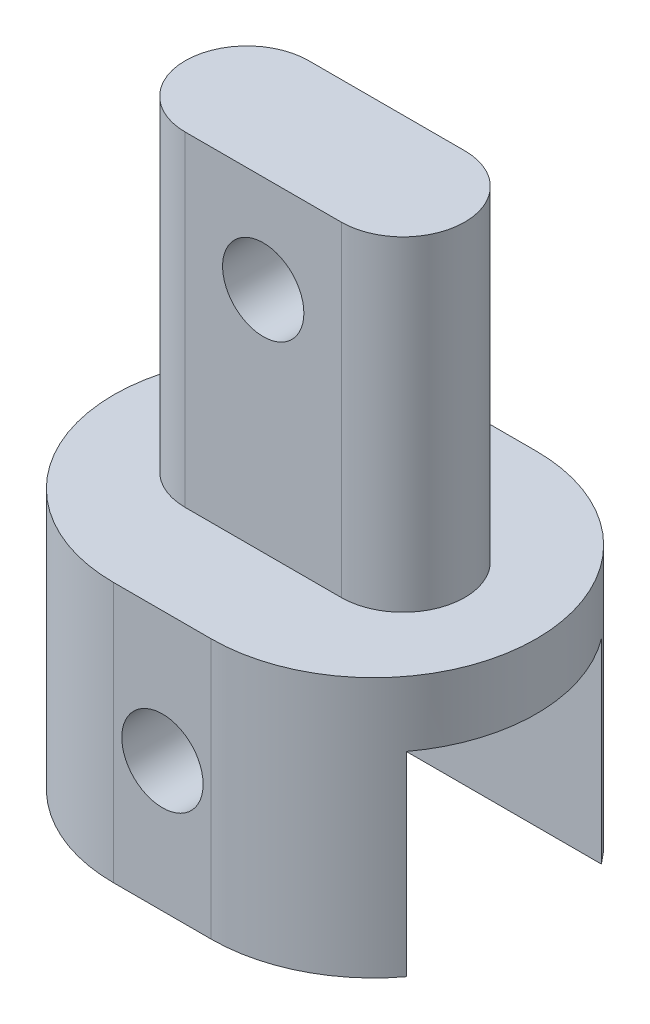
ISO-10303-21;
HEADER;
FILE_DESCRIPTION(('STEP AP214'),'2;1');
FILE_NAME('part.step','',(''),(''),'','','');
FILE_SCHEMA(('AUTOMOTIVE_DESIGN { 1 0 10303 214 1 1 1 1 }'));
ENDSEC;
DATA;
#1=APPLICATION_CONTEXT('core data for automotive mechanical design processes');
#2=APPLICATION_PROTOCOL_DEFINITION('international standard','automotive_design',2000,#1);
#3=PRODUCT_CONTEXT('',#1,'mechanical');
#4=PRODUCT('Part','Part','',(#3));
#5=PRODUCT_RELATED_PRODUCT_CATEGORY('part','',(#4));
#6=PRODUCT_DEFINITION_FORMATION('','',#4);
#7=PRODUCT_DEFINITION_CONTEXT('part definition',#1,'design');
#8=PRODUCT_DEFINITION('design','',#6,#7);
#9=PRODUCT_DEFINITION_SHAPE('','',#8);
#10=(LENGTH_UNIT() NAMED_UNIT(*) SI_UNIT(.MILLI.,.METRE.));
#11=(NAMED_UNIT(*) PLANE_ANGLE_UNIT() SI_UNIT($,.RADIAN.));
#12=(NAMED_UNIT(*) SI_UNIT($,.STERADIAN.) SOLID_ANGLE_UNIT());
#13=UNCERTAINTY_MEASURE_WITH_UNIT(LENGTH_MEASURE(1.E-05),#10,'distance_accuracy_value','');
#14=(GEOMETRIC_REPRESENTATION_CONTEXT(3) GLOBAL_UNCERTAINTY_ASSIGNED_CONTEXT((#13)) GLOBAL_UNIT_ASSIGNED_CONTEXT((#10,
#11,#12)) REPRESENTATION_CONTEXT('',''));
#15=CARTESIAN_POINT('',(0.,0.,0.));
#16=DIRECTION('',(0.,0.,1.));
#17=DIRECTION('',(1.,0.,0.));
#18=AXIS2_PLACEMENT_3D('',#15,#16,#17);
#19=CARTESIAN_POINT('',(-1.5,0.,0.));
#20=DIRECTION('',(0.,1.,0.));
#21=DIRECTION('',(0.,0.,1.));
#22=AXIS2_PLACEMENT_3D('',#19,#20,#21);
#23=PLANE('',#22);
#24=CARTESIAN_POINT('',(1.5,0.,0.));
#25=DIRECTION('',(0.,1.,0.));
#26=DIRECTION('',(0.,0.,1.));
#27=AXIS2_PLACEMENT_3D('',#24,#25,#26);
#28=CIRCLE('',#27,5.);
#29=CARTESIAN_POINT('',(5.5,0.,-3.));
#30=VERTEX_POINT('',#29);
#31=CARTESIAN_POINT('',(1.5,0.,-5.));
#32=VERTEX_POINT('',#31);
#33=EDGE_CURVE('E170',#30,#32,#28,.T.);
#34=ORIENTED_EDGE('',*,*,#33,.F.);
#35=DIRECTION('',(-1.,0.,0.));
#36=VECTOR('',#35,1.);
#37=CARTESIAN_POINT('',(-1.5,0.,-3.));
#38=LINE('',#37,#36);
#39=CARTESIAN_POINT('',(-5.5,0.,-3.));
#40=VERTEX_POINT('',#39);
#41=EDGE_CURVE('E57',#30,#40,#38,.T.);
#42=ORIENTED_EDGE('',*,*,#41,.T.);
#43=CARTESIAN_POINT('',(-1.5,0.,0.));
#44=DIRECTION('',(0.,1.,0.));
#45=DIRECTION('',(0.,0.,1.));
#46=AXIS2_PLACEMENT_3D('',#43,#44,#45);
#47=CIRCLE('',#46,5.);
#48=CARTESIAN_POINT('',(-1.5,0.,-5.));
#49=VERTEX_POINT('',#48);
#50=EDGE_CURVE('E159',#49,#40,#47,.T.);
#51=ORIENTED_EDGE('',*,*,#50,.F.);
#52=DIRECTION('',(-1.,0.,0.));
#53=VECTOR('',#52,1.);
#54=CARTESIAN_POINT('',(-1.5,0.,-5.));
#55=LINE('',#54,#53);
#56=EDGE_CURVE('E173',#32,#49,#55,.T.);
#57=ORIENTED_EDGE('',*,*,#56,.F.);
#58=EDGE_LOOP('',(#34,#42,#51,#57));
#59=FACE_BOUND('',#58,.T.);
#60=ADVANCED_FACE('F48',(#59),#23,.F.);
#61=CARTESIAN_POINT('',(-1.5,8.,0.));
#62=DIRECTION('',(0.,-1.,0.));
#63=DIRECTION('',(0.,0.,-1.));
#64=AXIS2_PLACEMENT_3D('',#61,#62,#63);
#65=CYLINDRICAL_SURFACE('',#64,5.);
#66=ORIENTED_EDGE('',*,*,#50,.T.);
#67=DIRECTION('',(0.,-1.,0.));
#68=VECTOR('',#67,1.);
#69=CARTESIAN_POINT('',(-5.5,8.,-3.));
#70=LINE('',#69,#68);
#71=CARTESIAN_POINT('',(-5.5,6.,-3.));
#72=VERTEX_POINT('',#71);
#73=EDGE_CURVE('E197',#40,#72,#70,.F.);
#74=ORIENTED_EDGE('',*,*,#73,.T.);
#75=CARTESIAN_POINT('',(-1.5,6.,0.));
#76=DIRECTION('',(0.,-1.,0.));
#77=DIRECTION('',(0.,0.,-1.));
#78=AXIS2_PLACEMENT_3D('',#75,#76,#77);
#79=CIRCLE('',#78,5.);
#80=CARTESIAN_POINT('',(-5.5,6.,3.));
#81=VERTEX_POINT('',#80);
#82=EDGE_CURVE('E153',#81,#72,#79,.T.);
#83=ORIENTED_EDGE('',*,*,#82,.F.);
#84=DIRECTION('',(0.,-1.,0.));
#85=VECTOR('',#84,1.);
#86=CARTESIAN_POINT('',(-5.5,8.,3.));
#87=LINE('',#86,#85);
#88=CARTESIAN_POINT('',(-5.5,0.,3.));
#89=VERTEX_POINT('',#88);
#90=EDGE_CURVE('E138',#81,#89,#87,.T.);
#91=ORIENTED_EDGE('',*,*,#90,.T.);
#92=CARTESIAN_POINT('',(-1.5,0.,5.));
#93=VERTEX_POINT('',#92);
#94=EDGE_CURVE('E150',#89,#93,#47,.T.);
#95=ORIENTED_EDGE('',*,*,#94,.T.);
#96=DIRECTION('',(0.,-1.,0.));
#97=VECTOR('',#96,1.);
#98=CARTESIAN_POINT('',(-1.5,8.,5.));
#99=LINE('',#98,#97);
#100=CARTESIAN_POINT('',(-1.5,8.,5.));
#101=VERTEX_POINT('',#100);
#102=EDGE_CURVE('E144',#101,#93,#99,.T.);
#103=ORIENTED_EDGE('',*,*,#102,.F.);
#104=CARTESIAN_POINT('',(-1.5,8.,0.));
#105=DIRECTION('',(0.,1.,0.));
#106=DIRECTION('',(0.,0.,1.));
#107=AXIS2_PLACEMENT_3D('',#104,#105,#106);
#108=CIRCLE('',#107,5.);
#109=CARTESIAN_POINT('',(-1.5,8.,-5.));
#110=VERTEX_POINT('',#109);
#111=EDGE_CURVE('E175',#110,#101,#108,.T.);
#112=ORIENTED_EDGE('',*,*,#111,.F.);
#113=DIRECTION('',(0.,-1.,0.));
#114=VECTOR('',#113,1.);
#115=CARTESIAN_POINT('',(-1.5,8.,-5.));
#116=LINE('',#115,#114);
#117=EDGE_CURVE('E176',#110,#49,#116,.T.);
#118=ORIENTED_EDGE('',*,*,#117,.T.);
#119=EDGE_LOOP('',(#66,#74,#83,#91,#95,#103,#112,#118));
#120=FACE_BOUND('',#119,.T.);
#121=ADVANCED_FACE('F50',(#120),#65,.T.);
#122=CARTESIAN_POINT('',(-1.5,8.,5.));
#123=DIRECTION('',(0.,0.,-1.));
#124=DIRECTION('',(-1.,0.,0.));
#125=AXIS2_PLACEMENT_3D('',#122,#123,#124);
#126=PLANE('',#125);
#127=CARTESIAN_POINT('',(0.,4.,5.));
#128=DIRECTION('',(0.,0.,1.));
#129=DIRECTION('',(1.,0.,0.));
#130=AXIS2_PLACEMENT_3D('',#127,#128,#129);
#131=CIRCLE('',#130,1.25);
#132=CARTESIAN_POINT('',(1.25,4.,5.));
#133=VERTEX_POINT('',#132);
#134=EDGE_CURVE('E260',#133,#133,#131,.T.);
#135=ORIENTED_EDGE('',*,*,#134,.F.);
#136=EDGE_LOOP('',(#135));
#137=FACE_BOUND('',#136,.T.);
#138=DIRECTION('',(1.,0.,0.));
#139=VECTOR('',#138,1.);
#140=CARTESIAN_POINT('',(-1.5,0.,5.));
#141=LINE('',#140,#139);
#142=CARTESIAN_POINT('',(1.5,0.,5.));
#143=VERTEX_POINT('',#142);
#144=EDGE_CURVE('E157',#93,#143,#141,.T.);
#145=ORIENTED_EDGE('',*,*,#144,.T.);
#146=DIRECTION('',(0.,-1.,0.));
#147=VECTOR('',#146,1.);
#148=CARTESIAN_POINT('',(1.5,8.,5.));
#149=LINE('',#148,#147);
#150=CARTESIAN_POINT('',(1.5,8.,5.));
#151=VERTEX_POINT('',#150);
#152=EDGE_CURVE('E182',#151,#143,#149,.T.);
#153=ORIENTED_EDGE('',*,*,#152,.F.);
#154=DIRECTION('',(1.,0.,0.));
#155=VECTOR('',#154,1.);
#156=CARTESIAN_POINT('',(-1.5,8.,5.));
#157=LINE('',#156,#155);
#158=EDGE_CURVE('E246',#101,#151,#157,.T.);
#159=ORIENTED_EDGE('',*,*,#158,.F.);
#160=ORIENTED_EDGE('',*,*,#102,.T.);
#161=EDGE_LOOP('',(#145,#153,#159,#160));
#162=FACE_BOUND('',#161,.T.);
#163=ADVANCED_FACE('F251',(#137,#162),#126,.F.);
#164=CARTESIAN_POINT('',(1.5,8.,0.));
#165=DIRECTION('',(0.,-1.,0.));
#166=DIRECTION('',(0.,0.,-1.));
#167=AXIS2_PLACEMENT_3D('',#164,#165,#166);
#168=CYLINDRICAL_SURFACE('',#167,5.);
#169=CARTESIAN_POINT('',(1.5,6.,0.));
#170=DIRECTION('',(0.,-1.,0.));
#171=DIRECTION('',(0.,0.,-1.));
#172=AXIS2_PLACEMENT_3D('',#169,#170,#171);
#173=CIRCLE('',#172,5.);
#174=CARTESIAN_POINT('',(5.5,6.,-3.));
#175=VERTEX_POINT('',#174);
#176=CARTESIAN_POINT('',(5.5,6.,3.));
#177=VERTEX_POINT('',#176);
#178=EDGE_CURVE('E13',#175,#177,#173,.T.);
#179=ORIENTED_EDGE('',*,*,#178,.F.);
#180=DIRECTION('',(0.,-1.,0.));
#181=VECTOR('',#180,1.);
#182=CARTESIAN_POINT('',(5.5,8.,-3.));
#183=LINE('',#182,#181);
#184=EDGE_CURVE('E154',#175,#30,#183,.T.);
#185=ORIENTED_EDGE('',*,*,#184,.T.);
#186=ORIENTED_EDGE('',*,*,#33,.T.);
#187=DIRECTION('',(0.,-1.,0.));
#188=VECTOR('',#187,1.);
#189=CARTESIAN_POINT('',(1.5,8.,-5.));
#190=LINE('',#189,#188);
#191=CARTESIAN_POINT('',(1.5,8.,-5.));
#192=VERTEX_POINT('',#191);
#193=EDGE_CURVE('E179',#192,#32,#190,.T.);
#194=ORIENTED_EDGE('',*,*,#193,.F.);
#195=CARTESIAN_POINT('',(1.5,8.,0.));
#196=DIRECTION('',(0.,1.,0.));
#197=DIRECTION('',(0.,0.,1.));
#198=AXIS2_PLACEMENT_3D('',#195,#196,#197);
#199=CIRCLE('',#198,5.);
#200=EDGE_CURVE('E209',#151,#192,#199,.T.);
#201=ORIENTED_EDGE('',*,*,#200,.F.);
#202=ORIENTED_EDGE('',*,*,#152,.T.);
#203=CARTESIAN_POINT('',(5.5,0.,3.));
#204=VERTEX_POINT('',#203);
#205=EDGE_CURVE('E171',#143,#204,#28,.T.);
#206=ORIENTED_EDGE('',*,*,#205,.T.);
#207=DIRECTION('',(0.,-1.,0.));
#208=VECTOR('',#207,1.);
#209=CARTESIAN_POINT('',(5.5,8.,3.));
#210=LINE('',#209,#208);
#211=EDGE_CURVE('E64',#204,#177,#210,.F.);
#212=ORIENTED_EDGE('',*,*,#211,.T.);
#213=EDGE_LOOP('',(#179,#185,#186,#194,#201,#202,#206,#212));
#214=FACE_BOUND('',#213,.T.);
#215=ADVANCED_FACE('F208',(#214),#168,.T.);
#216=CARTESIAN_POINT('',(-1.5,8.,-5.));
#217=DIRECTION('',(0.,0.,1.));
#218=DIRECTION('',(1.,0.,0.));
#219=AXIS2_PLACEMENT_3D('',#216,#217,#218);
#220=PLANE('',#219);
#221=CARTESIAN_POINT('',(0.,4.,-5.));
#222=DIRECTION('',(0.,0.,1.));
#223=DIRECTION('',(1.,0.,0.));
#224=AXIS2_PLACEMENT_3D('',#221,#222,#223);
#225=CIRCLE('',#224,1.25);
#226=CARTESIAN_POINT('',(1.25,4.,-5.));
#227=VERTEX_POINT('',#226);
#228=EDGE_CURVE('E263',#227,#227,#225,.T.);
#229=ORIENTED_EDGE('',*,*,#228,.T.);
#230=EDGE_LOOP('',(#229));
#231=FACE_BOUND('',#230,.T.);
#232=ORIENTED_EDGE('',*,*,#56,.T.);
#233=ORIENTED_EDGE('',*,*,#117,.F.);
#234=DIRECTION('',(-1.,0.,0.));
#235=VECTOR('',#234,1.);
#236=CARTESIAN_POINT('',(-1.5,8.,-5.));
#237=LINE('',#236,#235);
#238=EDGE_CURVE('E167',#192,#110,#237,.T.);
#239=ORIENTED_EDGE('',*,*,#238,.F.);
#240=ORIENTED_EDGE('',*,*,#193,.T.);
#241=EDGE_LOOP('',(#232,#233,#239,#240));
#242=FACE_BOUND('',#241,.T.);
#243=ADVANCED_FACE('F203',(#231,#242),#220,.F.);
#244=CARTESIAN_POINT('',(-1.5,8.,0.));
#245=DIRECTION('',(0.,1.,0.));
#246=DIRECTION('',(0.,0.,1.));
#247=AXIS2_PLACEMENT_3D('',#244,#245,#246);
#248=PLANE('',#247);
#249=CARTESIAN_POINT('',(-2.4,8.,0.));
#250=DIRECTION('',(0.,1.,0.));
#251=DIRECTION('',(0.,0.,1.));
#252=AXIS2_PLACEMENT_3D('',#249,#250,#251);
#253=CIRCLE('',#252,1.9);
#254=CARTESIAN_POINT('',(-2.4,8.,-1.9));
#255=VERTEX_POINT('',#254);
#256=CARTESIAN_POINT('',(-2.4,8.,1.9));
#257=VERTEX_POINT('',#256);
#258=EDGE_CURVE('E72',#255,#257,#253,.T.);
#259=ORIENTED_EDGE('',*,*,#258,.F.);
#260=DIRECTION('',(-1.,0.,0.));
#261=VECTOR('',#260,1.);
#262=CARTESIAN_POINT('',(-2.4,8.,-1.9));
#263=LINE('',#262,#261);
#264=CARTESIAN_POINT('',(2.4,8.,-1.9));
#265=VERTEX_POINT('',#264);
#266=EDGE_CURVE('E223',#265,#255,#263,.T.);
#267=ORIENTED_EDGE('',*,*,#266,.F.);
#268=CARTESIAN_POINT('',(2.4,8.,0.));
#269=DIRECTION('',(0.,1.,0.));
#270=DIRECTION('',(0.,0.,1.));
#271=AXIS2_PLACEMENT_3D('',#268,#269,#270);
#272=CIRCLE('',#271,1.9);
#273=CARTESIAN_POINT('',(2.4,8.,1.9));
#274=VERTEX_POINT('',#273);
#275=EDGE_CURVE('E234',#274,#265,#272,.T.);
#276=ORIENTED_EDGE('',*,*,#275,.F.);
#277=DIRECTION('',(1.,0.,0.));
#278=VECTOR('',#277,1.);
#279=CARTESIAN_POINT('',(-2.4,8.,1.9));
#280=LINE('',#279,#278);
#281=EDGE_CURVE('E231',#257,#274,#280,.T.);
#282=ORIENTED_EDGE('',*,*,#281,.F.);
#283=EDGE_LOOP('',(#259,#267,#276,#282));
#284=FACE_BOUND('',#283,.T.);
#285=ORIENTED_EDGE('',*,*,#111,.T.);
#286=ORIENTED_EDGE('',*,*,#158,.T.);
#287=ORIENTED_EDGE('',*,*,#200,.T.);
#288=ORIENTED_EDGE('',*,*,#238,.T.);
#289=EDGE_LOOP('',(#285,#286,#287,#288));
#290=FACE_BOUND('',#289,.T.);
#291=ADVANCED_FACE('F248',(#284,#290),#248,.T.);
#292=ORIENTED_EDGE('',*,*,#94,.F.);
#293=DIRECTION('',(1.,0.,0.));
#294=VECTOR('',#293,1.);
#295=CARTESIAN_POINT('',(-1.5,0.,3.));
#296=LINE('',#295,#294);
#297=EDGE_CURVE('E135',#89,#204,#296,.T.);
#298=ORIENTED_EDGE('',*,*,#297,.T.);
#299=ORIENTED_EDGE('',*,*,#205,.F.);
#300=ORIENTED_EDGE('',*,*,#144,.F.);
#301=EDGE_LOOP('',(#292,#298,#299,#300));
#302=FACE_BOUND('',#301,.T.);
#303=ADVANCED_FACE('F156',(#302),#23,.F.);
#304=CARTESIAN_POINT('',(-2.4,18.,0.));
#305=DIRECTION('',(0.,-1.,0.));
#306=DIRECTION('',(0.,0.,-1.));
#307=AXIS2_PLACEMENT_3D('',#304,#305,#306);
#308=CYLINDRICAL_SURFACE('',#307,1.9);
#309=ORIENTED_EDGE('',*,*,#258,.T.);
#310=DIRECTION('',(0.,-1.,0.));
#311=VECTOR('',#310,1.);
#312=CARTESIAN_POINT('',(-2.4,18.,1.9));
#313=LINE('',#312,#311);
#314=CARTESIAN_POINT('',(-2.4,18.,1.9));
#315=VERTEX_POINT('',#314);
#316=EDGE_CURVE('E160',#315,#257,#313,.T.);
#317=ORIENTED_EDGE('',*,*,#316,.F.);
#318=CARTESIAN_POINT('',(-2.4,18.,0.));
#319=DIRECTION('',(0.,1.,0.));
#320=DIRECTION('',(0.,0.,1.));
#321=AXIS2_PLACEMENT_3D('',#318,#319,#320);
#322=CIRCLE('',#321,1.9);
#323=CARTESIAN_POINT('',(-2.4,18.,-1.9));
#324=VERTEX_POINT('',#323);
#325=EDGE_CURVE('E219',#324,#315,#322,.T.);
#326=ORIENTED_EDGE('',*,*,#325,.F.);
#327=DIRECTION('',(0.,-1.,0.));
#328=VECTOR('',#327,1.);
#329=CARTESIAN_POINT('',(-2.4,18.,-1.9));
#330=LINE('',#329,#328);
#331=EDGE_CURVE('E229',#324,#255,#330,.T.);
#332=ORIENTED_EDGE('',*,*,#331,.T.);
#333=EDGE_LOOP('',(#309,#317,#326,#332));
#334=FACE_BOUND('',#333,.T.);
#335=ADVANCED_FACE('F292',(#334),#308,.T.);
#336=CARTESIAN_POINT('',(-2.4,18.,1.9));
#337=DIRECTION('',(0.,0.,-1.));
#338=DIRECTION('',(-1.,0.,0.));
#339=AXIS2_PLACEMENT_3D('',#336,#337,#338);
#340=PLANE('',#339);
#341=CARTESIAN_POINT('',(0.,15.,1.9));
#342=DIRECTION('',(0.,0.,1.));
#343=DIRECTION('',(1.,0.,0.));
#344=AXIS2_PLACEMENT_3D('',#341,#342,#343);
#345=CIRCLE('',#344,1.25);
#346=CARTESIAN_POINT('',(1.25,15.,1.9));
#347=VERTEX_POINT('',#346);
#348=EDGE_CURVE('E188',#347,#347,#345,.T.);
#349=ORIENTED_EDGE('',*,*,#348,.F.);
#350=EDGE_LOOP('',(#349));
#351=FACE_BOUND('',#350,.T.);
#352=ORIENTED_EDGE('',*,*,#281,.T.);
#353=DIRECTION('',(0.,-1.,0.));
#354=VECTOR('',#353,1.);
#355=CARTESIAN_POINT('',(2.4,18.,1.9));
#356=LINE('',#355,#354);
#357=CARTESIAN_POINT('',(2.4,18.,1.9));
#358=VERTEX_POINT('',#357);
#359=EDGE_CURVE('E163',#358,#274,#356,.T.);
#360=ORIENTED_EDGE('',*,*,#359,.F.);
#361=DIRECTION('',(1.,0.,0.));
#362=VECTOR('',#361,1.);
#363=CARTESIAN_POINT('',(-2.4,18.,1.9));
#364=LINE('',#363,#362);
#365=EDGE_CURVE('E222',#315,#358,#364,.T.);
#366=ORIENTED_EDGE('',*,*,#365,.F.);
#367=ORIENTED_EDGE('',*,*,#316,.T.);
#368=EDGE_LOOP('',(#352,#360,#366,#367));
#369=FACE_BOUND('',#368,.T.);
#370=ADVANCED_FACE('F297',(#351,#369),#340,.F.);
#371=CARTESIAN_POINT('',(2.4,18.,0.));
#372=DIRECTION('',(0.,-1.,0.));
#373=DIRECTION('',(0.,0.,-1.));
#374=AXIS2_PLACEMENT_3D('',#371,#372,#373);
#375=CYLINDRICAL_SURFACE('',#374,1.9);
#376=ORIENTED_EDGE('',*,*,#275,.T.);
#377=DIRECTION('',(0.,-1.,0.));
#378=VECTOR('',#377,1.);
#379=CARTESIAN_POINT('',(2.4,18.,-1.9));
#380=LINE('',#379,#378);
#381=CARTESIAN_POINT('',(2.4,18.,-1.9));
#382=VERTEX_POINT('',#381);
#383=EDGE_CURVE('E240',#382,#265,#380,.T.);
#384=ORIENTED_EDGE('',*,*,#383,.F.);
#385=CARTESIAN_POINT('',(2.4,18.,0.));
#386=DIRECTION('',(0.,1.,0.));
#387=DIRECTION('',(0.,0.,1.));
#388=AXIS2_PLACEMENT_3D('',#385,#386,#387);
#389=CIRCLE('',#388,1.9);
#390=EDGE_CURVE('E225',#358,#382,#389,.T.);
#391=ORIENTED_EDGE('',*,*,#390,.F.);
#392=ORIENTED_EDGE('',*,*,#359,.T.);
#393=EDGE_LOOP('',(#376,#384,#391,#392));
#394=FACE_BOUND('',#393,.T.);
#395=ADVANCED_FACE('F306',(#394),#375,.T.);
#396=CARTESIAN_POINT('',(-2.4,18.,-1.9));
#397=DIRECTION('',(0.,0.,1.));
#398=DIRECTION('',(1.,0.,0.));
#399=AXIS2_PLACEMENT_3D('',#396,#397,#398);
#400=PLANE('',#399);
#401=CARTESIAN_POINT('',(0.,15.,-1.9));
#402=DIRECTION('',(0.,0.,1.));
#403=DIRECTION('',(1.,0.,0.));
#404=AXIS2_PLACEMENT_3D('',#401,#402,#403);
#405=CIRCLE('',#404,1.25);
#406=CARTESIAN_POINT('',(1.25,15.,-1.9));
#407=VERTEX_POINT('',#406);
#408=EDGE_CURVE('E186',#407,#407,#405,.T.);
#409=ORIENTED_EDGE('',*,*,#408,.T.);
#410=EDGE_LOOP('',(#409));
#411=FACE_BOUND('',#410,.T.);
#412=ORIENTED_EDGE('',*,*,#266,.T.);
#413=ORIENTED_EDGE('',*,*,#331,.F.);
#414=DIRECTION('',(-1.,0.,0.));
#415=VECTOR('',#414,1.);
#416=CARTESIAN_POINT('',(-2.4,18.,-1.9));
#417=LINE('',#416,#415);
#418=EDGE_CURVE('E227',#382,#324,#417,.T.);
#419=ORIENTED_EDGE('',*,*,#418,.F.);
#420=ORIENTED_EDGE('',*,*,#383,.T.);
#421=EDGE_LOOP('',(#412,#413,#419,#420));
#422=FACE_BOUND('',#421,.T.);
#423=ADVANCED_FACE('F310',(#411,#422),#400,.F.);
#424=CARTESIAN_POINT('',(-2.4,18.,0.));
#425=DIRECTION('',(0.,1.,0.));
#426=DIRECTION('',(0.,0.,1.));
#427=AXIS2_PLACEMENT_3D('',#424,#425,#426);
#428=PLANE('',#427);
#429=ORIENTED_EDGE('',*,*,#325,.T.);
#430=ORIENTED_EDGE('',*,*,#365,.T.);
#431=ORIENTED_EDGE('',*,*,#390,.T.);
#432=ORIENTED_EDGE('',*,*,#418,.T.);
#433=EDGE_LOOP('',(#429,#430,#431,#432));
#434=FACE_BOUND('',#433,.T.);
#435=ADVANCED_FACE('F314',(#434),#428,.T.);
#436=CARTESIAN_POINT('',(0.,15.,-4.1));
#437=DIRECTION('',(0.,0.,1.));
#438=DIRECTION('',(1.,0.,0.));
#439=AXIS2_PLACEMENT_3D('',#436,#437,#438);
#440=CYLINDRICAL_SURFACE('',#439,1.25);
#441=ORIENTED_EDGE('',*,*,#348,.T.);
#442=EDGE_LOOP('',(#441));
#443=FACE_BOUND('',#442,.T.);
#444=ORIENTED_EDGE('',*,*,#408,.F.);
#445=EDGE_LOOP('',(#444));
#446=FACE_BOUND('',#445,.T.);
#447=ADVANCED_FACE('F318',(#443,#446),#440,.F.);
#448=CARTESIAN_POINT('',(0.,6.,0.));
#449=DIRECTION('',(0.,-1.,0.));
#450=DIRECTION('',(0.,0.,-1.));
#451=AXIS2_PLACEMENT_3D('',#448,#449,#450);
#452=PLANE('',#451);
#453=ORIENTED_EDGE('',*,*,#82,.T.);
#454=DIRECTION('',(1.,0.,0.));
#455=VECTOR('',#454,1.);
#456=CARTESIAN_POINT('',(-12.5595557948941,6.,-3.));
#457=LINE('',#456,#455);
#458=EDGE_CURVE('E252',#72,#175,#457,.T.);
#459=ORIENTED_EDGE('',*,*,#458,.T.);
#460=ORIENTED_EDGE('',*,*,#178,.T.);
#461=DIRECTION('',(-1.,0.,0.));
#462=VECTOR('',#461,1.);
#463=CARTESIAN_POINT('',(-12.5595557948941,6.,3.));
#464=LINE('',#463,#462);
#465=EDGE_CURVE('E253',#177,#81,#464,.T.);
#466=ORIENTED_EDGE('',*,*,#465,.T.);
#467=EDGE_LOOP('',(#453,#459,#460,#466));
#468=FACE_BOUND('',#467,.T.);
#469=ADVANCED_FACE('F321',(#468),#452,.T.);
#470=CARTESIAN_POINT('',(-12.5595557948941,6.,-3.));
#471=DIRECTION('',(0.,0.,-1.));
#472=DIRECTION('',(-1.,0.,0.));
#473=AXIS2_PLACEMENT_3D('',#470,#471,#472);
#474=PLANE('',#473);
#475=CARTESIAN_POINT('',(0.,4.,-3.));
#476=DIRECTION('',(0.,0.,-1.));
#477=DIRECTION('',(-1.,0.,0.));
#478=AXIS2_PLACEMENT_3D('',#475,#476,#477);
#479=CIRCLE('',#478,1.25);
#480=CARTESIAN_POINT('',(-1.25,4.,-3.));
#481=VERTEX_POINT('',#480);
#482=EDGE_CURVE('E257',#481,#481,#479,.T.);
#483=ORIENTED_EDGE('',*,*,#482,.T.);
#484=EDGE_LOOP('',(#483));
#485=FACE_BOUND('',#484,.T.);
#486=ORIENTED_EDGE('',*,*,#41,.F.);
#487=ORIENTED_EDGE('',*,*,#184,.F.);
#488=ORIENTED_EDGE('',*,*,#458,.F.);
#489=ORIENTED_EDGE('',*,*,#73,.F.);
#490=EDGE_LOOP('',(#486,#487,#488,#489));
#491=FACE_BOUND('',#490,.T.);
#492=ADVANCED_FACE('F281',(#485,#491),#474,.F.);
#493=CARTESIAN_POINT('',(-12.5595557948941,6.,3.));
#494=DIRECTION('',(0.,0.,1.));
#495=DIRECTION('',(1.,0.,0.));
#496=AXIS2_PLACEMENT_3D('',#493,#494,#495);
#497=PLANE('',#496);
#498=CARTESIAN_POINT('',(0.,4.,3.));
#499=DIRECTION('',(0.,0.,1.));
#500=DIRECTION('',(1.,0.,0.));
#501=AXIS2_PLACEMENT_3D('',#498,#499,#500);
#502=CIRCLE('',#501,1.25);
#503=CARTESIAN_POINT('',(1.25,4.,3.));
#504=VERTEX_POINT('',#503);
#505=EDGE_CURVE('E52',#504,#504,#502,.T.);
#506=ORIENTED_EDGE('',*,*,#505,.T.);
#507=EDGE_LOOP('',(#506));
#508=FACE_BOUND('',#507,.T.);
#509=ORIENTED_EDGE('',*,*,#465,.F.);
#510=ORIENTED_EDGE('',*,*,#211,.F.);
#511=ORIENTED_EDGE('',*,*,#297,.F.);
#512=ORIENTED_EDGE('',*,*,#90,.F.);
#513=EDGE_LOOP('',(#509,#510,#511,#512));
#514=FACE_BOUND('',#513,.T.);
#515=ADVANCED_FACE('F137',(#508,#514),#497,.F.);
#516=CARTESIAN_POINT('',(0.,4.,-5.));
#517=DIRECTION('',(0.,0.,1.));
#518=DIRECTION('',(1.,0.,0.));
#519=AXIS2_PLACEMENT_3D('',#516,#517,#518);
#520=CYLINDRICAL_SURFACE('',#519,1.25);
#521=ORIENTED_EDGE('',*,*,#134,.T.);
#522=EDGE_LOOP('',(#521));
#523=FACE_BOUND('',#522,.T.);
#524=ORIENTED_EDGE('',*,*,#505,.F.);
#525=EDGE_LOOP('',(#524));
#526=FACE_BOUND('',#525,.T.);
#527=ADVANCED_FACE('F271',(#523,#526),#520,.F.);
#528=ORIENTED_EDGE('',*,*,#228,.F.);
#529=EDGE_LOOP('',(#528));
#530=FACE_BOUND('',#529,.T.);
#531=ORIENTED_EDGE('',*,*,#482,.F.);
#532=EDGE_LOOP('',(#531));
#533=FACE_BOUND('',#532,.T.);
#534=ADVANCED_FACE('F273',(#530,#533),#520,.F.);
#535=CLOSED_SHELL('',(#60,#121,#163,#215,#243,#291,#303,#335,#370,#395,#423,#435,#447,#469,#492,
#515,#527,#534));
#536=MANIFOLD_SOLID_BREP('B2',#535);
#537=ADVANCED_BREP_SHAPE_REPRESENTATION('',(#18,#536),#14);
#538=SHAPE_DEFINITION_REPRESENTATION(#9,#537);
ENDSEC;
END-ISO-10303-21;
